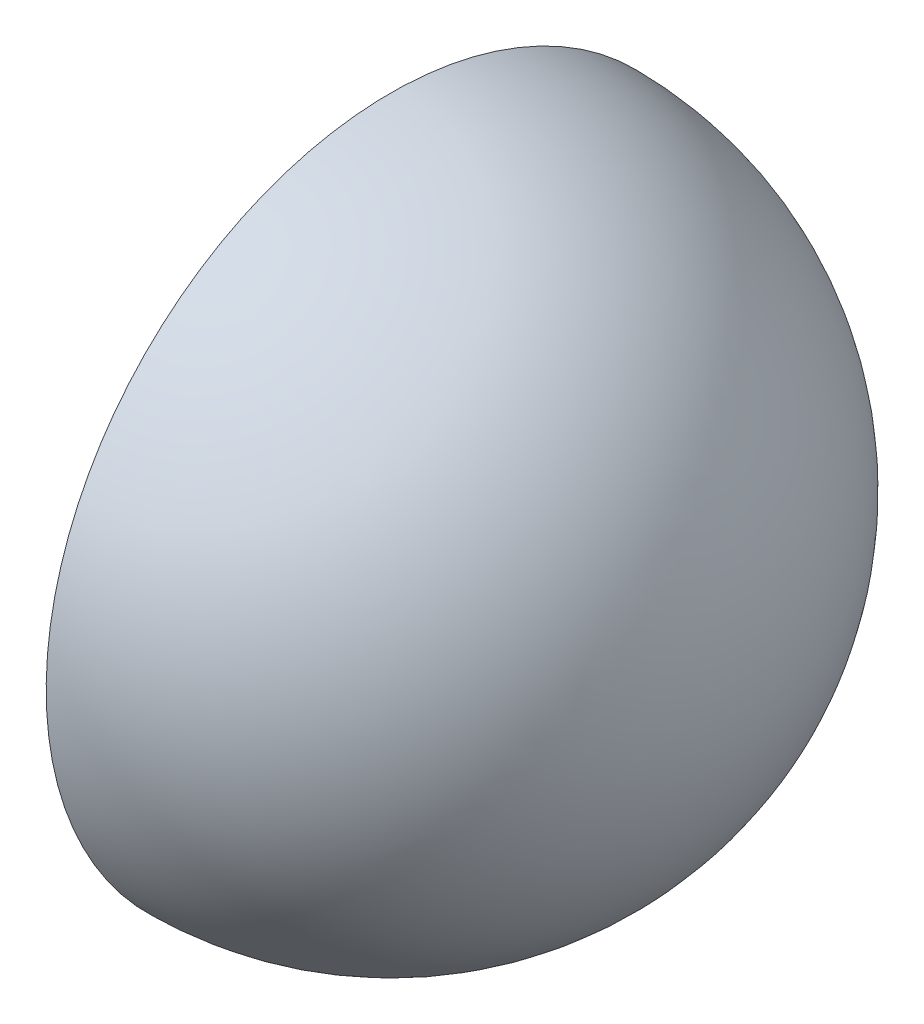
ISO-10303-21;
HEADER;
FILE_DESCRIPTION(('STEP AP214'),'2;1');
FILE_NAME('part.step','',(''),(''),'','','');
FILE_SCHEMA(('AUTOMOTIVE_DESIGN { 1 0 10303 214 1 1 1 1 }'));
ENDSEC;
DATA;
#1=APPLICATION_CONTEXT('core data for automotive mechanical design processes');
#2=APPLICATION_PROTOCOL_DEFINITION('international standard','automotive_design',2000,#1);
#3=PRODUCT_CONTEXT('',#1,'mechanical');
#4=PRODUCT('Part','Part','',(#3));
#5=PRODUCT_RELATED_PRODUCT_CATEGORY('part','',(#4));
#6=PRODUCT_DEFINITION_FORMATION('','',#4);
#7=PRODUCT_DEFINITION_CONTEXT('part definition',#1,'design');
#8=PRODUCT_DEFINITION('design','',#6,#7);
#9=PRODUCT_DEFINITION_SHAPE('','',#8);
#10=(LENGTH_UNIT() NAMED_UNIT(*) SI_UNIT(.MILLI.,.METRE.));
#11=(NAMED_UNIT(*) PLANE_ANGLE_UNIT() SI_UNIT($,.RADIAN.));
#12=(NAMED_UNIT(*) SI_UNIT($,.STERADIAN.) SOLID_ANGLE_UNIT());
#13=UNCERTAINTY_MEASURE_WITH_UNIT(LENGTH_MEASURE(1.E-05),#10,'distance_accuracy_value','');
#14=(GEOMETRIC_REPRESENTATION_CONTEXT(3) GLOBAL_UNCERTAINTY_ASSIGNED_CONTEXT((#13)) GLOBAL_UNIT_ASSIGNED_CONTEXT((#10,
#11,#12)) REPRESENTATION_CONTEXT('',''));
#15=CARTESIAN_POINT('',(0.,0.,0.));
#16=DIRECTION('',(0.,0.,1.));
#17=DIRECTION('',(1.,0.,0.));
#18=AXIS2_PLACEMENT_3D('',#15,#16,#17);
#19=CARTESIAN_POINT('',(189.317023445003,0.,0.));
#20=DIRECTION('',(-1.,0.,0.));
#21=DIRECTION('',(0.,-1.,0.));
#22=AXIS2_PLACEMENT_3D('',#19,#20,#21);
#23=SPHERICAL_SURFACE('',#22,77.9999999999991);
#24=CARTESIAN_POINT('',(189.317023445003,0.,0.));
#25=DIRECTION('',(-1.,0.,0.));
#26=DIRECTION('',(0.,-1.,0.));
#27=AXIS2_PLACEMENT_3D('',#24,#25,#26);
#28=CIRCLE('',#27,77.9999999999992);
#29=CARTESIAN_POINT('',(189.317023445003,-77.9999999999991,0.));
#30=VERTEX_POINT('',#29);
#31=EDGE_CURVE('E37',#30,#30,#28,.T.);
#32=ORIENTED_EDGE('',*,*,#31,.F.);
#33=EDGE_LOOP('',(#32));
#34=FACE_BOUND('',#33,.T.);
#35=ADVANCED_FACE('F31',(#34),#23,.T.);
#36=CARTESIAN_POINT('',(189.317023445003,0.,0.));
#37=DIRECTION('',(-1.,0.,0.));
#38=DIRECTION('',(0.,-1.,0.));
#39=AXIS2_PLACEMENT_3D('',#36,#37,#38);
#40=SPHERICAL_SURFACE('',#39,74.9999999999991);
#41=CARTESIAN_POINT('',(189.317023445003,0.,0.));
#42=DIRECTION('',(-1.,0.,0.));
#43=DIRECTION('',(0.,-1.,0.));
#44=AXIS2_PLACEMENT_3D('',#41,#42,#43);
#45=CIRCLE('',#44,74.9999999999991);
#46=CARTESIAN_POINT('',(189.317023445003,-74.9999999999991,0.));
#47=VERTEX_POINT('',#46);
#48=EDGE_CURVE('E10',#47,#47,#45,.T.);
#49=ORIENTED_EDGE('',*,*,#48,.T.);
#50=EDGE_LOOP('',(#49));
#51=FACE_BOUND('',#50,.T.);
#52=ADVANCED_FACE('F47',(#51),#40,.F.);
#53=CARTESIAN_POINT('',(189.317023445003,-74.9999999999991,0.));
#54=DIRECTION('',(-1.,0.,0.));
#55=DIRECTION('',(0.,-1.,0.));
#56=AXIS2_PLACEMENT_3D('',#53,#54,#55);
#57=PLANE('',#56);
#58=ORIENTED_EDGE('',*,*,#31,.T.);
#59=EDGE_LOOP('',(#58));
#60=FACE_BOUND('',#59,.T.);
#61=ORIENTED_EDGE('',*,*,#48,.F.);
#62=EDGE_LOOP('',(#61));
#63=FACE_BOUND('',#62,.T.);
#64=ADVANCED_FACE('F43',(#60,#63),#57,.T.);
#65=CLOSED_SHELL('',(#35,#52,#64));
#66=MANIFOLD_SOLID_BREP('B2',#65);
#67=ADVANCED_BREP_SHAPE_REPRESENTATION('',(#18,#66),#14);
#68=SHAPE_DEFINITION_REPRESENTATION(#9,#67);
ENDSEC;
END-ISO-10303-21;
